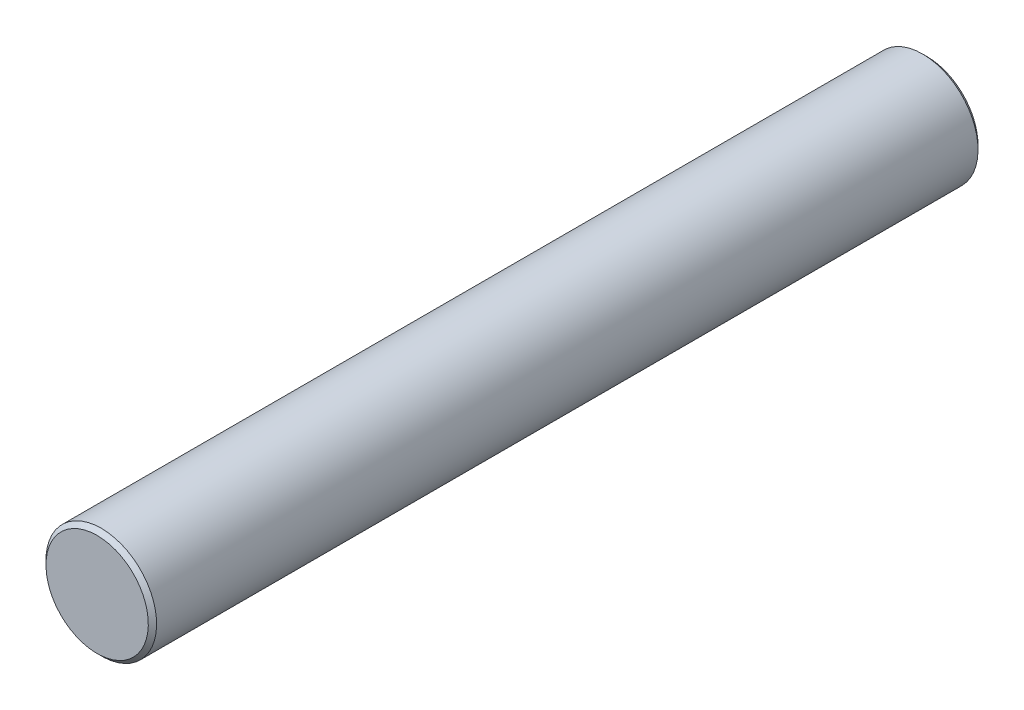
ISO-10303-21;
HEADER;
FILE_DESCRIPTION(('STEP AP214'),'2;1');
FILE_NAME('part.step','',(''),(''),'','','');
FILE_SCHEMA(('AUTOMOTIVE_DESIGN { 1 0 10303 214 1 1 1 1 }'));
ENDSEC;
DATA;
#1=APPLICATION_CONTEXT('core data for automotive mechanical design processes');
#2=APPLICATION_PROTOCOL_DEFINITION('international standard','automotive_design',2000,#1);
#3=PRODUCT_CONTEXT('',#1,'mechanical');
#4=PRODUCT('Part','Part','',(#3));
#5=PRODUCT_RELATED_PRODUCT_CATEGORY('part','',(#4));
#6=PRODUCT_DEFINITION_FORMATION('','',#4);
#7=PRODUCT_DEFINITION_CONTEXT('part definition',#1,'design');
#8=PRODUCT_DEFINITION('design','',#6,#7);
#9=PRODUCT_DEFINITION_SHAPE('','',#8);
#10=(LENGTH_UNIT() NAMED_UNIT(*) SI_UNIT(.MILLI.,.METRE.));
#11=(NAMED_UNIT(*) PLANE_ANGLE_UNIT() SI_UNIT($,.RADIAN.));
#12=(NAMED_UNIT(*) SI_UNIT($,.STERADIAN.) SOLID_ANGLE_UNIT());
#13=UNCERTAINTY_MEASURE_WITH_UNIT(LENGTH_MEASURE(1.E-05),#10,'distance_accuracy_value','');
#14=(GEOMETRIC_REPRESENTATION_CONTEXT(3) GLOBAL_UNCERTAINTY_ASSIGNED_CONTEXT((#13)) GLOBAL_UNIT_ASSIGNED_CONTEXT((#10,
#11,#12)) REPRESENTATION_CONTEXT('',''));
#15=CARTESIAN_POINT('',(0.,0.,0.));
#16=DIRECTION('',(0.,0.,1.));
#17=DIRECTION('',(1.,0.,0.));
#18=AXIS2_PLACEMENT_3D('',#15,#16,#17);
#19=CARTESIAN_POINT('',(0.,9.25,0.));
#20=DIRECTION('',(0.,0.,-1.));
#21=DIRECTION('',(0.,1.,0.));
#22=AXIS2_PLACEMENT_3D('',#19,#20,#21);
#23=PLANE('',#22);
#24=CARTESIAN_POINT('',(0.,0.,0.));
#25=DIRECTION('',(0.,0.,-1.));
#26=DIRECTION('',(0.,1.,0.));
#27=AXIS2_PLACEMENT_3D('',#24,#25,#26);
#28=CIRCLE('',#27,18.5);
#29=CARTESIAN_POINT('',(0.,18.5,0.));
#30=VERTEX_POINT('',#29);
#31=EDGE_CURVE('E9',#30,#30,#28,.T.);
#32=ORIENTED_EDGE('',*,*,#31,.T.);
#33=EDGE_LOOP('',(#32));
#34=FACE_BOUND('',#33,.T.);
#35=CARTESIAN_POINT('',(0.,0.,0.));
#36=DIRECTION('',(0.,0.,1.));
#37=DIRECTION('',(-1.,0.,0.));
#38=AXIS2_PLACEMENT_3D('',#35,#36,#37);
#39=CIRCLE('',#38,6.);
#40=CARTESIAN_POINT('',(-6.,0.,0.));
#41=VERTEX_POINT('',#40);
#42=EDGE_CURVE('E52',#41,#41,#39,.T.);
#43=ORIENTED_EDGE('',*,*,#42,.T.);
#44=EDGE_LOOP('',(#43));
#45=FACE_BOUND('',#44,.T.);
#46=ADVANCED_FACE('F15',(#34,#45),#23,.T.);
#47=CARTESIAN_POINT('',(0.,0.,0.75));
#48=DIRECTION('',(0.,0.,1.));
#49=DIRECTION('',(0.,1.,0.));
#50=AXIS2_PLACEMENT_3D('',#47,#48,#49);
#51=CONICAL_SURFACE('',#50,19.25,0.785398163397448);
#52=CARTESIAN_POINT('',(0.,0.,1.5));
#53=DIRECTION('',(0.,0.,-1.));
#54=DIRECTION('',(0.,1.,0.));
#55=AXIS2_PLACEMENT_3D('',#52,#53,#54);
#56=CIRCLE('',#55,20.);
#57=CARTESIAN_POINT('',(0.,20.,1.5));
#58=VERTEX_POINT('',#57);
#59=EDGE_CURVE('E25',#58,#58,#56,.T.);
#60=ORIENTED_EDGE('',*,*,#59,.T.);
#61=EDGE_LOOP('',(#60));
#62=FACE_BOUND('',#61,.T.);
#63=ORIENTED_EDGE('',*,*,#31,.F.);
#64=EDGE_LOOP('',(#63));
#65=FACE_BOUND('',#64,.T.);
#66=ADVANCED_FACE('F121',(#62,#65),#51,.T.);
#67=CARTESIAN_POINT('',(0.,0.,150.));
#68=DIRECTION('',(0.,0.,1.));
#69=DIRECTION('',(0.,1.,0.));
#70=AXIS2_PLACEMENT_3D('',#67,#68,#69);
#71=CYLINDRICAL_SURFACE('',#70,20.);
#72=CARTESIAN_POINT('',(0.,0.,298.5));
#73=DIRECTION('',(0.,0.,-1.));
#74=DIRECTION('',(0.,1.,0.));
#75=AXIS2_PLACEMENT_3D('',#72,#73,#74);
#76=CIRCLE('',#75,20.);
#77=CARTESIAN_POINT('',(0.,20.,298.5));
#78=VERTEX_POINT('',#77);
#79=EDGE_CURVE('E19',#78,#78,#76,.T.);
#80=ORIENTED_EDGE('',*,*,#79,.T.);
#81=EDGE_LOOP('',(#80));
#82=FACE_BOUND('',#81,.T.);
#83=ORIENTED_EDGE('',*,*,#59,.F.);
#84=EDGE_LOOP('',(#83));
#85=FACE_BOUND('',#84,.T.);
#86=CARTESIAN_POINT('',(0.,0.,6.5));
#87=DIRECTION('',(0.,0.,-1.));
#88=DIRECTION('',(0.,1.,0.));
#89=AXIS2_PLACEMENT_3D('',#86,#87,#88);
#90=CIRCLE('',#89,20.);
#91=CARTESIAN_POINT('',(10.5356537528527,-17.,6.5));
#92=VERTEX_POINT('',#91);
#93=CARTESIAN_POINT('',(-10.5356537528527,-17.,6.5));
#94=VERTEX_POINT('',#93);
#95=EDGE_CURVE('E69',#92,#94,#90,.T.);
#96=ORIENTED_EDGE('',*,*,#95,.T.);
#97=DIRECTION('',(0.,0.,1.));
#98=VECTOR('',#97,1.);
#99=CARTESIAN_POINT('',(-10.5356537528527,-17.,8.25));
#100=LINE('',#99,#98);
#101=CARTESIAN_POINT('',(-10.5356537528527,-17.,10.));
#102=VERTEX_POINT('',#101);
#103=EDGE_CURVE('E62',#94,#102,#100,.T.);
#104=ORIENTED_EDGE('',*,*,#103,.T.);
#105=CARTESIAN_POINT('',(0.,0.,10.));
#106=DIRECTION('',(0.,0.,1.));
#107=DIRECTION('',(0.,1.,0.));
#108=AXIS2_PLACEMENT_3D('',#105,#106,#107);
#109=CIRCLE('',#108,20.);
#110=CARTESIAN_POINT('',(10.5356537528527,-17.,10.));
#111=VERTEX_POINT('',#110);
#112=EDGE_CURVE('E75',#102,#111,#109,.T.);
#113=ORIENTED_EDGE('',*,*,#112,.T.);
#114=DIRECTION('',(0.,0.,-1.));
#115=VECTOR('',#114,1.);
#116=CARTESIAN_POINT('',(10.5356537528527,-17.,8.25));
#117=LINE('',#116,#115);
#118=EDGE_CURVE('E60',#111,#92,#117,.T.);
#119=ORIENTED_EDGE('',*,*,#118,.T.);
#120=EDGE_LOOP('',(#96,#104,#113,#119));
#121=FACE_BOUND('',#120,.T.);
#122=ADVANCED_FACE('F17',(#82,#85,#121),#71,.T.);
#123=CARTESIAN_POINT('',(0.,0.,299.25));
#124=DIRECTION('',(0.,0.,-1.));
#125=DIRECTION('',(0.,1.,0.));
#126=AXIS2_PLACEMENT_3D('',#123,#124,#125);
#127=CONICAL_SURFACE('',#126,19.25,0.785398163397448);
#128=CARTESIAN_POINT('',(0.,0.,300.));
#129=DIRECTION('',(0.,0.,-1.));
#130=DIRECTION('',(0.,1.,0.));
#131=AXIS2_PLACEMENT_3D('',#128,#129,#130);
#132=CIRCLE('',#131,18.5);
#133=CARTESIAN_POINT('',(0.,18.5,300.));
#134=VERTEX_POINT('',#133);
#135=EDGE_CURVE('E44',#134,#134,#132,.T.);
#136=ORIENTED_EDGE('',*,*,#135,.T.);
#137=EDGE_LOOP('',(#136));
#138=FACE_BOUND('',#137,.T.);
#139=ORIENTED_EDGE('',*,*,#79,.F.);
#140=EDGE_LOOP('',(#139));
#141=FACE_BOUND('',#140,.T.);
#142=ADVANCED_FACE('F116',(#138,#141),#127,.T.);
#143=CARTESIAN_POINT('',(0.,9.25,300.));
#144=DIRECTION('',(0.,0.,1.));
#145=DIRECTION('',(0.,-1.,0.));
#146=AXIS2_PLACEMENT_3D('',#143,#144,#145);
#147=PLANE('',#146);
#148=ORIENTED_EDGE('',*,*,#135,.F.);
#149=EDGE_LOOP('',(#148));
#150=FACE_BOUND('',#149,.T.);
#151=ADVANCED_FACE('F110',(#150),#147,.T.);
#152=CARTESIAN_POINT('',(0.,0.,26.4586213285198));
#153=DIRECTION('',(0.,0.,-1.));
#154=DIRECTION('',(-1.,0.,0.));
#155=AXIS2_PLACEMENT_3D('',#152,#153,#154);
#156=CONICAL_SURFACE('',#155,2.52640625,1.0471975511966);
#157=CARTESIAN_POINT('',(0.,0.,25.));
#158=DIRECTION('',(0.,0.,1.));
#159=DIRECTION('',(-1.,0.,0.));
#160=AXIS2_PLACEMENT_3D('',#157,#158,#159);
#161=CIRCLE('',#160,5.0528125);
#162=CARTESIAN_POINT('',(-5.0528125,0.,25.));
#163=VERTEX_POINT('',#162);
#164=EDGE_CURVE('E51',#163,#163,#161,.T.);
#165=ORIENTED_EDGE('',*,*,#164,.F.);
#166=EDGE_LOOP('',(#165));
#167=FACE_BOUND('',#166,.T.);
#168=CARTESIAN_POINT('',(0.,0.,27.9172426570397));
#169=VERTEX_POINT('',#168);
#170=VERTEX_LOOP('',#169);
#171=FACE_BOUND('',#170,.T.);
#172=ADVANCED_FACE('F104',(#167,#171),#156,.F.);
#173=CARTESIAN_POINT('',(0.,0.,12.97359375));
#174=DIRECTION('',(0.,0.,-1.));
#175=DIRECTION('',(-1.,0.,0.));
#176=AXIS2_PLACEMENT_3D('',#173,#174,#175);
#177=CYLINDRICAL_SURFACE('',#176,5.0528125);
#178=CARTESIAN_POINT('',(0.,0.,0.9471875));
#179=DIRECTION('',(0.,0.,1.));
#180=DIRECTION('',(-1.,0.,0.));
#181=AXIS2_PLACEMENT_3D('',#178,#179,#180);
#182=CIRCLE('',#181,5.0528125);
#183=CARTESIAN_POINT('',(-5.0528125,0.,0.9471875));
#184=VERTEX_POINT('',#183);
#185=EDGE_CURVE('E57',#184,#184,#182,.T.);
#186=ORIENTED_EDGE('',*,*,#185,.F.);
#187=EDGE_LOOP('',(#186));
#188=FACE_BOUND('',#187,.T.);
#189=ORIENTED_EDGE('',*,*,#164,.T.);
#190=EDGE_LOOP('',(#189));
#191=FACE_BOUND('',#190,.T.);
#192=ADVANCED_FACE('F101',(#188,#191),#177,.F.);
#193=CARTESIAN_POINT('',(0.,0.,0.47359375));
#194=DIRECTION('',(0.,0.,-1.));
#195=DIRECTION('',(-1.,0.,0.));
#196=AXIS2_PLACEMENT_3D('',#193,#194,#195);
#197=CONICAL_SURFACE('',#196,5.52640625,0.785398163397448);
#198=ORIENTED_EDGE('',*,*,#42,.F.);
#199=EDGE_LOOP('',(#198));
#200=FACE_BOUND('',#199,.T.);
#201=ORIENTED_EDGE('',*,*,#185,.T.);
#202=EDGE_LOOP('',(#201));
#203=FACE_BOUND('',#202,.T.);
#204=ADVANCED_FACE('F99',(#200,#203),#197,.F.);
#205=CARTESIAN_POINT('',(0.,-17.,8.25));
#206=DIRECTION('',(0.,-1.,0.));
#207=DIRECTION('',(0.,0.,-1.));
#208=AXIS2_PLACEMENT_3D('',#205,#206,#207);
#209=PLANE('',#208);
#210=ORIENTED_EDGE('',*,*,#103,.F.);
#211=DIRECTION('',(1.,0.,0.));
#212=VECTOR('',#211,1.);
#213=CARTESIAN_POINT('',(0.,-17.,6.5));
#214=LINE('',#213,#212);
#215=EDGE_CURVE('E66',#94,#92,#214,.T.);
#216=ORIENTED_EDGE('',*,*,#215,.T.);
#217=ORIENTED_EDGE('',*,*,#118,.F.);
#218=DIRECTION('',(-1.,0.,0.));
#219=VECTOR('',#218,1.);
#220=CARTESIAN_POINT('',(0.,-17.,10.));
#221=LINE('',#220,#219);
#222=EDGE_CURVE('E72',#111,#102,#221,.T.);
#223=ORIENTED_EDGE('',*,*,#222,.T.);
#224=EDGE_LOOP('',(#210,#216,#217,#223));
#225=FACE_BOUND('',#224,.T.);
#226=ADVANCED_FACE('F131',(#225),#209,.T.);
#227=CARTESIAN_POINT('',(0.,-19.5,6.5));
#228=DIRECTION('',(0.,0.,1.));
#229=DIRECTION('',(1.,0.,0.));
#230=AXIS2_PLACEMENT_3D('',#227,#228,#229);
#231=PLANE('',#230);
#232=ORIENTED_EDGE('',*,*,#95,.F.);
#233=ORIENTED_EDGE('',*,*,#215,.F.);
#234=EDGE_LOOP('',(#232,#233));
#235=FACE_BOUND('',#234,.T.);
#236=ADVANCED_FACE('F135',(#235),#231,.T.);
#237=CARTESIAN_POINT('',(0.,-19.5,10.));
#238=DIRECTION('',(0.,0.,1.));
#239=DIRECTION('',(1.,0.,0.));
#240=AXIS2_PLACEMENT_3D('',#237,#238,#239);
#241=PLANE('',#240);
#242=ORIENTED_EDGE('',*,*,#112,.F.);
#243=ORIENTED_EDGE('',*,*,#222,.F.);
#244=EDGE_LOOP('',(#242,#243));
#245=FACE_BOUND('',#244,.T.);
#246=ADVANCED_FACE('F87',(#245),#241,.F.);
#247=CLOSED_SHELL('',(#46,#66,#122,#142,#151,#172,#192,#204,#226,#236,#246));
#248=MANIFOLD_SOLID_BREP('B1',#247);
#249=ADVANCED_BREP_SHAPE_REPRESENTATION('',(#18,#248),#14);
#250=SHAPE_DEFINITION_REPRESENTATION(#9,#249);
ENDSEC;
END-ISO-10303-21;
